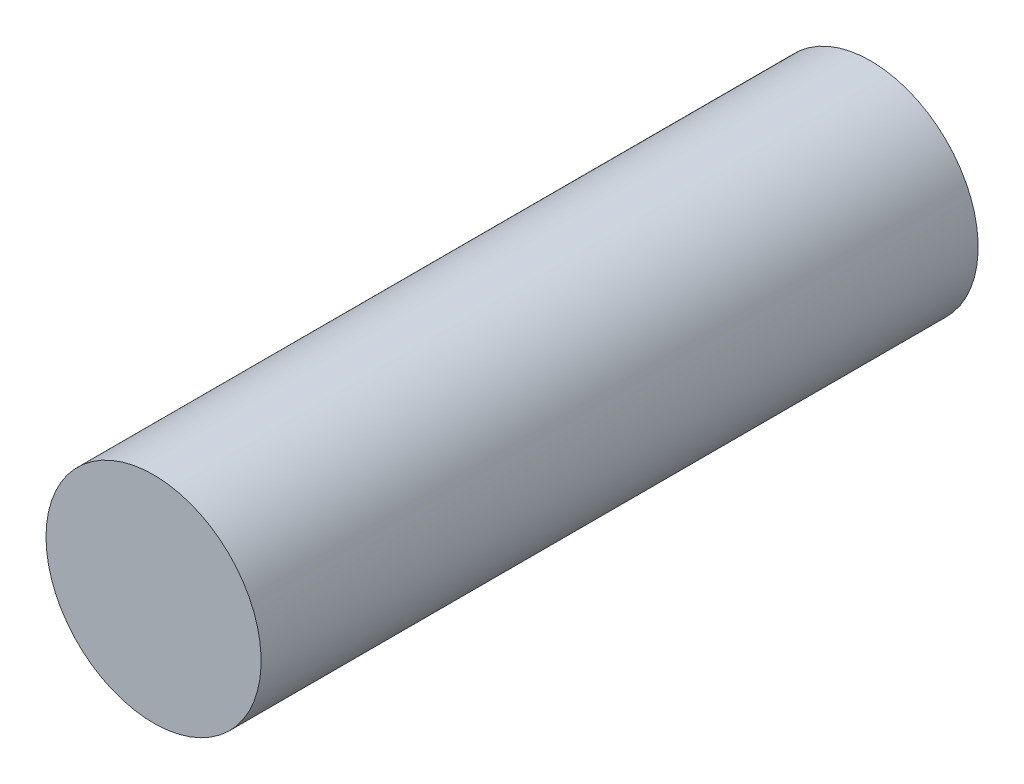
ISO-10303-21;
HEADER;
FILE_DESCRIPTION(('STEP AP214'),'2;1');
FILE_NAME('part.step','',(''),(''),'','','');
FILE_SCHEMA(('AUTOMOTIVE_DESIGN { 1 0 10303 214 1 1 1 1 }'));
ENDSEC;
DATA;
#1=APPLICATION_CONTEXT('core data for automotive mechanical design processes');
#2=APPLICATION_PROTOCOL_DEFINITION('international standard','automotive_design',2000,#1);
#3=PRODUCT_CONTEXT('',#1,'mechanical');
#4=PRODUCT('Part','Part','',(#3));
#5=PRODUCT_RELATED_PRODUCT_CATEGORY('part','',(#4));
#6=PRODUCT_DEFINITION_FORMATION('','',#4);
#7=PRODUCT_DEFINITION_CONTEXT('part definition',#1,'design');
#8=PRODUCT_DEFINITION('design','',#6,#7);
#9=PRODUCT_DEFINITION_SHAPE('','',#8);
#10=(LENGTH_UNIT() NAMED_UNIT(*) SI_UNIT(.MILLI.,.METRE.));
#11=(NAMED_UNIT(*) PLANE_ANGLE_UNIT() SI_UNIT($,.RADIAN.));
#12=(NAMED_UNIT(*) SI_UNIT($,.STERADIAN.) SOLID_ANGLE_UNIT());
#13=UNCERTAINTY_MEASURE_WITH_UNIT(LENGTH_MEASURE(1.E-05),#10,'distance_accuracy_value','');
#14=(GEOMETRIC_REPRESENTATION_CONTEXT(3) GLOBAL_UNCERTAINTY_ASSIGNED_CONTEXT((#13)) GLOBAL_UNIT_ASSIGNED_CONTEXT((#10,
#11,#12)) REPRESENTATION_CONTEXT('',''));
#15=CARTESIAN_POINT('',(0.,0.,0.));
#16=DIRECTION('',(0.,0.,1.));
#17=DIRECTION('',(1.,0.,0.));
#18=AXIS2_PLACEMENT_3D('',#15,#16,#17);
#19=CARTESIAN_POINT('',(0.4499991,0.,0.));
#20=DIRECTION('',(0.,0.,-1.));
#21=DIRECTION('',(-1.,0.,0.));
#22=AXIS2_PLACEMENT_3D('',#19,#20,#21);
#23=PLANE('',#22);
#24=CARTESIAN_POINT('',(0.,0.,0.));
#25=DIRECTION('',(0.,0.,-1.));
#26=DIRECTION('',(-1.,0.,0.));
#27=AXIS2_PLACEMENT_3D('',#24,#25,#26);
#28=CIRCLE('',#27,0.4499991);
#29=CARTESIAN_POINT('',(-0.4499991,0.,0.));
#30=VERTEX_POINT('',#29);
#31=EDGE_CURVE('E18',#30,#30,#28,.F.);
#32=ORIENTED_EDGE('',*,*,#31,.F.);
#33=EDGE_LOOP('',(#32));
#34=FACE_BOUND('',#33,.T.);
#35=ADVANCED_FACE('F15',(#34),#23,.T.);
#36=CARTESIAN_POINT('',(0.4499991,0.,2.99999908));
#37=DIRECTION('',(0.,0.,-1.));
#38=DIRECTION('',(-1.,0.,0.));
#39=AXIS2_PLACEMENT_3D('',#36,#37,#38);
#40=PLANE('',#39);
#41=CARTESIAN_POINT('',(0.,0.,2.99999908));
#42=DIRECTION('',(0.,0.,-1.));
#43=DIRECTION('',(-1.,0.,0.));
#44=AXIS2_PLACEMENT_3D('',#41,#42,#43);
#45=CIRCLE('',#44,0.4499991);
#46=CARTESIAN_POINT('',(-0.4499991,0.,2.99999908));
#47=VERTEX_POINT('',#46);
#48=EDGE_CURVE('E10',#47,#47,#45,.T.);
#49=ORIENTED_EDGE('',*,*,#48,.F.);
#50=EDGE_LOOP('',(#49));
#51=FACE_BOUND('',#50,.T.);
#52=ADVANCED_FACE('F30',(#51),#40,.F.);
#53=CARTESIAN_POINT('',(0.,0.,0.));
#54=DIRECTION('',(0.,0.,-1.));
#55=DIRECTION('',(-1.,0.,0.));
#56=AXIS2_PLACEMENT_3D('',#53,#54,#55);
#57=CYLINDRICAL_SURFACE('',#56,0.4499991);
#58=ORIENTED_EDGE('',*,*,#48,.T.);
#59=EDGE_LOOP('',(#58));
#60=FACE_BOUND('',#59,.T.);
#61=ORIENTED_EDGE('',*,*,#31,.T.);
#62=EDGE_LOOP('',(#61));
#63=FACE_BOUND('',#62,.T.);
#64=ADVANCED_FACE('F27',(#60,#63),#57,.T.);
#65=CLOSED_SHELL('',(#35,#52,#64));
#66=MANIFOLD_SOLID_BREP('B1',#65);
#67=ADVANCED_BREP_SHAPE_REPRESENTATION('',(#18,#66),#14);
#68=SHAPE_DEFINITION_REPRESENTATION(#9,#67);
ENDSEC;
END-ISO-10303-21;
